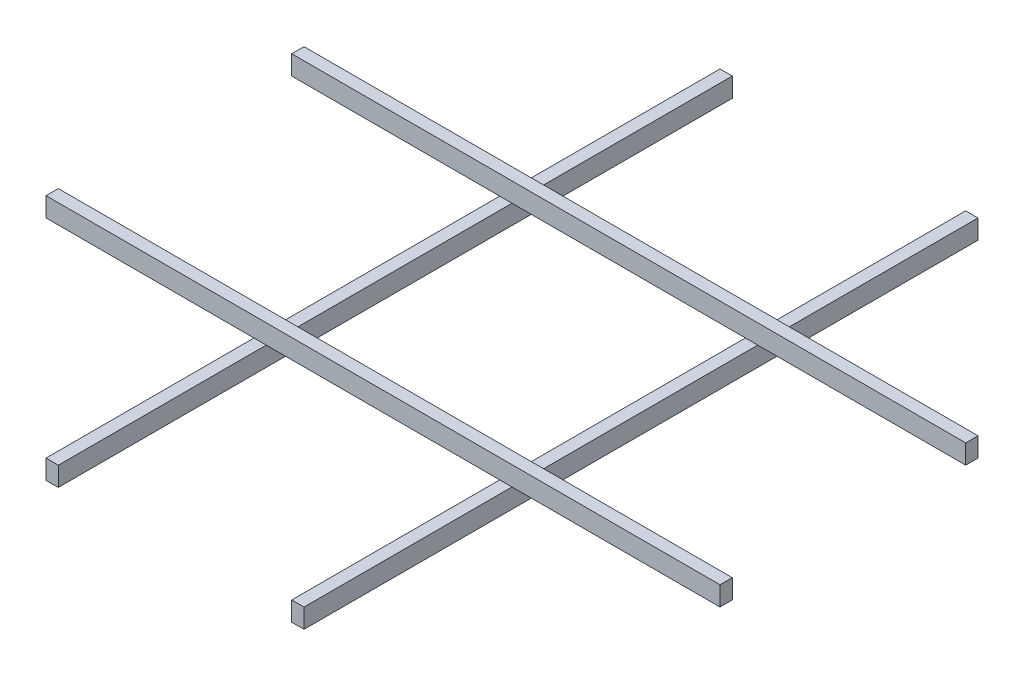
ISO-10303-21;
HEADER;
FILE_DESCRIPTION(('STEP AP214'),'2;1');
FILE_NAME('part.step','',(''),(''),'','','');
FILE_SCHEMA(('AUTOMOTIVE_DESIGN { 1 0 10303 214 1 1 1 1 }'));
ENDSEC;
DATA;
#1=APPLICATION_CONTEXT('core data for automotive mechanical design processes');
#2=APPLICATION_PROTOCOL_DEFINITION('international standard','automotive_design',2000,#1);
#3=PRODUCT_CONTEXT('',#1,'mechanical');
#4=PRODUCT('Part','Part','',(#3));
#5=PRODUCT_RELATED_PRODUCT_CATEGORY('part','',(#4));
#6=PRODUCT_DEFINITION_FORMATION('','',#4);
#7=PRODUCT_DEFINITION_CONTEXT('part definition',#1,'design');
#8=PRODUCT_DEFINITION('design','',#6,#7);
#9=PRODUCT_DEFINITION_SHAPE('','',#8);
#10=(LENGTH_UNIT() NAMED_UNIT(*) SI_UNIT(.MILLI.,.METRE.));
#11=(NAMED_UNIT(*) PLANE_ANGLE_UNIT() SI_UNIT($,.RADIAN.));
#12=(NAMED_UNIT(*) SI_UNIT($,.STERADIAN.) SOLID_ANGLE_UNIT());
#13=UNCERTAINTY_MEASURE_WITH_UNIT(LENGTH_MEASURE(1.E-05),#10,'distance_accuracy_value','');
#14=(GEOMETRIC_REPRESENTATION_CONTEXT(3) GLOBAL_UNCERTAINTY_ASSIGNED_CONTEXT((#13)) GLOBAL_UNIT_ASSIGNED_CONTEXT((#10,
#11,#12)) REPRESENTATION_CONTEXT('',''));
#15=CARTESIAN_POINT('',(0.,0.,0.));
#16=DIRECTION('',(0.,0.,1.));
#17=DIRECTION('',(1.,0.,0.));
#18=AXIS2_PLACEMENT_3D('',#15,#16,#17);
#19=CARTESIAN_POINT('',(4572.,209.55,-1593.85));
#20=DIRECTION('',(0.,0.,1.));
#21=DIRECTION('',(1.,0.,0.));
#22=AXIS2_PLACEMENT_3D('',#19,#20,#21);
#23=PLANE('',#22);
#24=DIRECTION('',(0.,1.,0.));
#25=VECTOR('',#24,1.);
#26=CARTESIAN_POINT('',(-304.8,209.55,-1593.85));
#27=LINE('',#26,#25);
#28=CARTESIAN_POINT('',(-304.8,69.85,-1593.85));
#29=VERTEX_POINT('',#28);
#30=CARTESIAN_POINT('',(-304.8,209.55,-1593.85));
#31=VERTEX_POINT('',#30);
#32=EDGE_CURVE('E126',#29,#31,#27,.T.);
#33=ORIENTED_EDGE('',*,*,#32,.T.);
#34=DIRECTION('',(-1.,0.,0.));
#35=VECTOR('',#34,1.);
#36=CARTESIAN_POINT('',(4572.,209.55,-1593.85));
#37=LINE('',#36,#35);
#38=CARTESIAN_POINT('',(4572.,209.55,-1593.85));
#39=VERTEX_POINT('',#38);
#40=EDGE_CURVE('E13',#39,#31,#37,.T.);
#41=ORIENTED_EDGE('',*,*,#40,.F.);
#42=DIRECTION('',(0.,1.,0.));
#43=VECTOR('',#42,1.);
#44=CARTESIAN_POINT('',(4572.,209.55,-1593.85));
#45=LINE('',#44,#43);
#46=CARTESIAN_POINT('',(4572.,69.85,-1593.85));
#47=VERTEX_POINT('',#46);
#48=EDGE_CURVE('E114',#47,#39,#45,.T.);
#49=ORIENTED_EDGE('',*,*,#48,.F.);
#50=DIRECTION('',(-1.,0.,0.));
#51=VECTOR('',#50,1.);
#52=CARTESIAN_POINT('',(4572.,69.85,-1593.85));
#53=LINE('',#52,#51);
#54=EDGE_CURVE('E122',#47,#29,#53,.T.);
#55=ORIENTED_EDGE('',*,*,#54,.T.);
#56=EDGE_LOOP('',(#33,#41,#49,#55));
#57=FACE_BOUND('',#56,.T.);
#58=ADVANCED_FACE('F63',(#57),#23,.F.);
#59=CARTESIAN_POINT('',(4572.,209.55,-1504.95));
#60=DIRECTION('',(0.,-1.,0.));
#61=DIRECTION('',(0.,0.,-1.));
#62=AXIS2_PLACEMENT_3D('',#59,#60,#61);
#63=PLANE('',#62);
#64=DIRECTION('',(0.,0.,1.));
#65=VECTOR('',#64,1.);
#66=CARTESIAN_POINT('',(-304.8,209.55,-1504.95));
#67=LINE('',#66,#65);
#68=CARTESIAN_POINT('',(-304.8,209.55,-1504.95));
#69=VERTEX_POINT('',#68);
#70=EDGE_CURVE('E118',#31,#69,#67,.T.);
#71=ORIENTED_EDGE('',*,*,#70,.T.);
#72=DIRECTION('',(-1.,0.,0.));
#73=VECTOR('',#72,1.);
#74=CARTESIAN_POINT('',(4572.,209.55,-1504.95));
#75=LINE('',#74,#73);
#76=CARTESIAN_POINT('',(4572.,209.55,-1504.95));
#77=VERTEX_POINT('',#76);
#78=EDGE_CURVE('E71',#77,#69,#75,.T.);
#79=ORIENTED_EDGE('',*,*,#78,.F.);
#80=DIRECTION('',(0.,0.,1.));
#81=VECTOR('',#80,1.);
#82=CARTESIAN_POINT('',(4572.,209.55,-1504.95));
#83=LINE('',#82,#81);
#84=EDGE_CURVE('E109',#39,#77,#83,.T.);
#85=ORIENTED_EDGE('',*,*,#84,.F.);
#86=ORIENTED_EDGE('',*,*,#40,.T.);
#87=EDGE_LOOP('',(#71,#79,#85,#86));
#88=FACE_BOUND('',#87,.T.);
#89=ADVANCED_FACE('F117',(#88),#63,.F.);
#90=CARTESIAN_POINT('',(4572.,209.55,-1504.95));
#91=DIRECTION('',(0.,0.,-1.));
#92=DIRECTION('',(-1.,0.,0.));
#93=AXIS2_PLACEMENT_3D('',#90,#91,#92);
#94=PLANE('',#93);
#95=DIRECTION('',(0.,-1.,0.));
#96=VECTOR('',#95,1.);
#97=CARTESIAN_POINT('',(-304.8,209.55,-1504.95));
#98=LINE('',#97,#96);
#99=CARTESIAN_POINT('',(-304.8,69.85,-1504.95));
#100=VERTEX_POINT('',#99);
#101=EDGE_CURVE('E96',#69,#100,#98,.T.);
#102=ORIENTED_EDGE('',*,*,#101,.T.);
#103=DIRECTION('',(-1.,0.,0.));
#104=VECTOR('',#103,1.);
#105=CARTESIAN_POINT('',(4572.,69.85,-1504.95));
#106=LINE('',#105,#104);
#107=CARTESIAN_POINT('',(4572.,69.85,-1504.95));
#108=VERTEX_POINT('',#107);
#109=EDGE_CURVE('E119',#108,#100,#106,.T.);
#110=ORIENTED_EDGE('',*,*,#109,.F.);
#111=DIRECTION('',(0.,-1.,0.));
#112=VECTOR('',#111,1.);
#113=CARTESIAN_POINT('',(4572.,209.55,-1504.95));
#114=LINE('',#113,#112);
#115=EDGE_CURVE('E112',#77,#108,#114,.T.);
#116=ORIENTED_EDGE('',*,*,#115,.F.);
#117=ORIENTED_EDGE('',*,*,#78,.T.);
#118=EDGE_LOOP('',(#102,#110,#116,#117));
#119=FACE_BOUND('',#118,.T.);
#120=ADVANCED_FACE('F120',(#119),#94,.F.);
#121=CARTESIAN_POINT('',(4572.,69.85,-1504.95));
#122=DIRECTION('',(0.,1.,0.));
#123=DIRECTION('',(0.,0.,1.));
#124=AXIS2_PLACEMENT_3D('',#121,#122,#123);
#125=PLANE('',#124);
#126=DIRECTION('',(0.,0.,-1.));
#127=VECTOR('',#126,1.);
#128=CARTESIAN_POINT('',(-304.8,69.85,-1504.95));
#129=LINE('',#128,#127);
#130=EDGE_CURVE('E102',#100,#29,#129,.T.);
#131=ORIENTED_EDGE('',*,*,#130,.T.);
#132=ORIENTED_EDGE('',*,*,#54,.F.);
#133=DIRECTION('',(0.,0.,-1.));
#134=VECTOR('',#133,1.);
#135=CARTESIAN_POINT('',(4572.,69.85,-1504.95));
#136=LINE('',#135,#134);
#137=EDGE_CURVE('E79',#108,#47,#136,.T.);
#138=ORIENTED_EDGE('',*,*,#137,.F.);
#139=ORIENTED_EDGE('',*,*,#109,.T.);
#140=EDGE_LOOP('',(#131,#132,#138,#139));
#141=FACE_BOUND('',#140,.T.);
#142=ADVANCED_FACE('F133',(#141),#125,.F.);
#143=CARTESIAN_POINT('',(4572.,139.7,-2794.));
#144=DIRECTION('',(1.,0.,0.));
#145=DIRECTION('',(0.,0.,-1.));
#146=AXIS2_PLACEMENT_3D('',#143,#144,#145);
#147=PLANE('',#146);
#148=ORIENTED_EDGE('',*,*,#48,.T.);
#149=ORIENTED_EDGE('',*,*,#84,.T.);
#150=ORIENTED_EDGE('',*,*,#115,.T.);
#151=ORIENTED_EDGE('',*,*,#137,.T.);
#152=EDGE_LOOP('',(#148,#149,#150,#151));
#153=FACE_BOUND('',#152,.T.);
#154=ADVANCED_FACE('F110',(#153),#147,.T.);
#155=CARTESIAN_POINT('',(-304.8,139.7,-2794.));
#156=DIRECTION('',(1.,0.,0.));
#157=DIRECTION('',(0.,0.,-1.));
#158=AXIS2_PLACEMENT_3D('',#155,#156,#157);
#159=PLANE('',#158);
#160=ORIENTED_EDGE('',*,*,#32,.F.);
#161=ORIENTED_EDGE('',*,*,#130,.F.);
#162=ORIENTED_EDGE('',*,*,#101,.F.);
#163=ORIENTED_EDGE('',*,*,#70,.F.);
#164=EDGE_LOOP('',(#160,#161,#162,#163));
#165=FACE_BOUND('',#164,.T.);
#166=ADVANCED_FACE('F136',(#165),#159,.F.);
#167=CLOSED_SHELL('',(#58,#89,#120,#142,#154,#166));
#168=MANIFOLD_SOLID_BREP('B2',#167);
#169=CARTESIAN_POINT('',(4572.,209.55,-3371.85));
#170=DIRECTION('',(0.,0.,1.));
#171=DIRECTION('',(1.,0.,0.));
#172=AXIS2_PLACEMENT_3D('',#169,#170,#171);
#173=PLANE('',#172);
#174=DIRECTION('',(0.,1.,0.));
#175=VECTOR('',#174,1.);
#176=CARTESIAN_POINT('',(-304.8,209.55,-3371.85));
#177=LINE('',#176,#175);
#178=CARTESIAN_POINT('',(-304.8,69.85,-3371.85));
#179=VERTEX_POINT('',#178);
#180=CARTESIAN_POINT('',(-304.8,209.55,-3371.85));
#181=VERTEX_POINT('',#180);
#182=EDGE_CURVE('E283',#179,#181,#177,.T.);
#183=ORIENTED_EDGE('',*,*,#182,.T.);
#184=DIRECTION('',(-1.,0.,0.));
#185=VECTOR('',#184,1.);
#186=CARTESIAN_POINT('',(4572.,209.55,-3371.85));
#187=LINE('',#186,#185);
#188=CARTESIAN_POINT('',(4572.,209.55,-3371.85));
#189=VERTEX_POINT('',#188);
#190=EDGE_CURVE('E61',#189,#181,#187,.T.);
#191=ORIENTED_EDGE('',*,*,#190,.F.);
#192=DIRECTION('',(0.,1.,0.));
#193=VECTOR('',#192,1.);
#194=CARTESIAN_POINT('',(4572.,209.55,-3371.85));
#195=LINE('',#194,#193);
#196=CARTESIAN_POINT('',(4572.,69.85,-3371.85));
#197=VERTEX_POINT('',#196);
#198=EDGE_CURVE('E271',#197,#189,#195,.T.);
#199=ORIENTED_EDGE('',*,*,#198,.F.);
#200=DIRECTION('',(-1.,0.,0.));
#201=VECTOR('',#200,1.);
#202=CARTESIAN_POINT('',(4572.,69.85,-3371.85));
#203=LINE('',#202,#201);
#204=EDGE_CURVE('E279',#197,#179,#203,.T.);
#205=ORIENTED_EDGE('',*,*,#204,.T.);
#206=EDGE_LOOP('',(#183,#191,#199,#205));
#207=FACE_BOUND('',#206,.T.);
#208=ADVANCED_FACE('F220',(#207),#173,.F.);
#209=CARTESIAN_POINT('',(4572.,209.55,-3282.95));
#210=DIRECTION('',(0.,-1.,0.));
#211=DIRECTION('',(0.,0.,-1.));
#212=AXIS2_PLACEMENT_3D('',#209,#210,#211);
#213=PLANE('',#212);
#214=DIRECTION('',(0.,0.,1.));
#215=VECTOR('',#214,1.);
#216=CARTESIAN_POINT('',(-304.8,209.55,-3282.95));
#217=LINE('',#216,#215);
#218=CARTESIAN_POINT('',(-304.8,209.55,-3282.95));
#219=VERTEX_POINT('',#218);
#220=EDGE_CURVE('E275',#181,#219,#217,.T.);
#221=ORIENTED_EDGE('',*,*,#220,.T.);
#222=DIRECTION('',(-1.,0.,0.));
#223=VECTOR('',#222,1.);
#224=CARTESIAN_POINT('',(4572.,209.55,-3282.95));
#225=LINE('',#224,#223);
#226=CARTESIAN_POINT('',(4572.,209.55,-3282.95));
#227=VERTEX_POINT('',#226);
#228=EDGE_CURVE('E228',#227,#219,#225,.T.);
#229=ORIENTED_EDGE('',*,*,#228,.F.);
#230=DIRECTION('',(0.,0.,1.));
#231=VECTOR('',#230,1.);
#232=CARTESIAN_POINT('',(4572.,209.55,-3282.95));
#233=LINE('',#232,#231);
#234=EDGE_CURVE('E266',#189,#227,#233,.T.);
#235=ORIENTED_EDGE('',*,*,#234,.F.);
#236=ORIENTED_EDGE('',*,*,#190,.T.);
#237=EDGE_LOOP('',(#221,#229,#235,#236));
#238=FACE_BOUND('',#237,.T.);
#239=ADVANCED_FACE('F274',(#238),#213,.F.);
#240=CARTESIAN_POINT('',(4572.,209.55,-3282.95));
#241=DIRECTION('',(0.,0.,-1.));
#242=DIRECTION('',(-1.,0.,0.));
#243=AXIS2_PLACEMENT_3D('',#240,#241,#242);
#244=PLANE('',#243);
#245=DIRECTION('',(0.,-1.,0.));
#246=VECTOR('',#245,1.);
#247=CARTESIAN_POINT('',(-304.8,209.55,-3282.95));
#248=LINE('',#247,#246);
#249=CARTESIAN_POINT('',(-304.8,69.85,-3282.95));
#250=VERTEX_POINT('',#249);
#251=EDGE_CURVE('E253',#219,#250,#248,.T.);
#252=ORIENTED_EDGE('',*,*,#251,.T.);
#253=DIRECTION('',(-1.,0.,0.));
#254=VECTOR('',#253,1.);
#255=CARTESIAN_POINT('',(4572.,69.85,-3282.95));
#256=LINE('',#255,#254);
#257=CARTESIAN_POINT('',(4572.,69.85,-3282.95));
#258=VERTEX_POINT('',#257);
#259=EDGE_CURVE('E276',#258,#250,#256,.T.);
#260=ORIENTED_EDGE('',*,*,#259,.F.);
#261=DIRECTION('',(0.,-1.,0.));
#262=VECTOR('',#261,1.);
#263=CARTESIAN_POINT('',(4572.,209.55,-3282.95));
#264=LINE('',#263,#262);
#265=EDGE_CURVE('E269',#227,#258,#264,.T.);
#266=ORIENTED_EDGE('',*,*,#265,.F.);
#267=ORIENTED_EDGE('',*,*,#228,.T.);
#268=EDGE_LOOP('',(#252,#260,#266,#267));
#269=FACE_BOUND('',#268,.T.);
#270=ADVANCED_FACE('F277',(#269),#244,.F.);
#271=CARTESIAN_POINT('',(4572.,69.85,-3282.95));
#272=DIRECTION('',(0.,1.,0.));
#273=DIRECTION('',(0.,0.,1.));
#274=AXIS2_PLACEMENT_3D('',#271,#272,#273);
#275=PLANE('',#274);
#276=DIRECTION('',(0.,0.,-1.));
#277=VECTOR('',#276,1.);
#278=CARTESIAN_POINT('',(-304.8,69.85,-3282.95));
#279=LINE('',#278,#277);
#280=EDGE_CURVE('E259',#250,#179,#279,.T.);
#281=ORIENTED_EDGE('',*,*,#280,.T.);
#282=ORIENTED_EDGE('',*,*,#204,.F.);
#283=DIRECTION('',(0.,0.,-1.));
#284=VECTOR('',#283,1.);
#285=CARTESIAN_POINT('',(4572.,69.85,-3282.95));
#286=LINE('',#285,#284);
#287=EDGE_CURVE('E236',#258,#197,#286,.T.);
#288=ORIENTED_EDGE('',*,*,#287,.F.);
#289=ORIENTED_EDGE('',*,*,#259,.T.);
#290=EDGE_LOOP('',(#281,#282,#288,#289));
#291=FACE_BOUND('',#290,.T.);
#292=ADVANCED_FACE('F290',(#291),#275,.F.);
#293=CARTESIAN_POINT('',(4572.,139.7,-4572.));
#294=DIRECTION('',(1.,0.,0.));
#295=DIRECTION('',(0.,0.,-1.));
#296=AXIS2_PLACEMENT_3D('',#293,#294,#295);
#297=PLANE('',#296);
#298=ORIENTED_EDGE('',*,*,#198,.T.);
#299=ORIENTED_EDGE('',*,*,#234,.T.);
#300=ORIENTED_EDGE('',*,*,#265,.T.);
#301=ORIENTED_EDGE('',*,*,#287,.T.);
#302=EDGE_LOOP('',(#298,#299,#300,#301));
#303=FACE_BOUND('',#302,.T.);
#304=ADVANCED_FACE('F267',(#303),#297,.T.);
#305=CARTESIAN_POINT('',(-304.8,139.7,-4572.));
#306=DIRECTION('',(1.,0.,0.));
#307=DIRECTION('',(0.,0.,-1.));
#308=AXIS2_PLACEMENT_3D('',#305,#306,#307);
#309=PLANE('',#308);
#310=ORIENTED_EDGE('',*,*,#182,.F.);
#311=ORIENTED_EDGE('',*,*,#280,.F.);
#312=ORIENTED_EDGE('',*,*,#251,.F.);
#313=ORIENTED_EDGE('',*,*,#220,.F.);
#314=EDGE_LOOP('',(#310,#311,#312,#313));
#315=FACE_BOUND('',#314,.T.);
#316=ADVANCED_FACE('F293',(#315),#309,.F.);
#317=CLOSED_SHELL('',(#208,#239,#270,#292,#304,#316));
#318=MANIFOLD_SOLID_BREP('B7',#317);
#319=CARTESIAN_POINT('',(2978.15,69.85,-4876.8));
#320=DIRECTION('',(1.,0.,0.));
#321=DIRECTION('',(0.,0.,-1.));
#322=AXIS2_PLACEMENT_3D('',#319,#320,#321);
#323=PLANE('',#322);
#324=DIRECTION('',(0.,1.,0.));
#325=VECTOR('',#324,1.);
#326=CARTESIAN_POINT('',(2978.15,69.85,2.28629310932819E-13));
#327=LINE('',#326,#325);
#328=CARTESIAN_POINT('',(2978.15,-69.85,2.28629310932819E-13));
#329=VERTEX_POINT('',#328);
#330=CARTESIAN_POINT('',(2978.15,69.85,2.28629310932819E-13));
#331=VERTEX_POINT('',#330);
#332=EDGE_CURVE('E439',#329,#331,#327,.T.);
#333=ORIENTED_EDGE('',*,*,#332,.T.);
#334=DIRECTION('',(0.,0.,1.));
#335=VECTOR('',#334,1.);
#336=CARTESIAN_POINT('',(2978.15,69.85,-4876.8));
#337=LINE('',#336,#335);
#338=CARTESIAN_POINT('',(2978.15,69.85,-4876.8));
#339=VERTEX_POINT('',#338);
#340=EDGE_CURVE('E218',#339,#331,#337,.T.);
#341=ORIENTED_EDGE('',*,*,#340,.F.);
#342=DIRECTION('',(0.,1.,0.));
#343=VECTOR('',#342,1.);
#344=CARTESIAN_POINT('',(2978.15,69.85,-4876.8));
#345=LINE('',#344,#343);
#346=CARTESIAN_POINT('',(2978.15,-69.85,-4876.8));
#347=VERTEX_POINT('',#346);
#348=EDGE_CURVE('E427',#347,#339,#345,.T.);
#349=ORIENTED_EDGE('',*,*,#348,.F.);
#350=DIRECTION('',(0.,0.,1.));
#351=VECTOR('',#350,1.);
#352=CARTESIAN_POINT('',(2978.15,-69.85,-4876.8));
#353=LINE('',#352,#351);
#354=EDGE_CURVE('E435',#347,#329,#353,.T.);
#355=ORIENTED_EDGE('',*,*,#354,.T.);
#356=EDGE_LOOP('',(#333,#341,#349,#355));
#357=FACE_BOUND('',#356,.T.);
#358=ADVANCED_FACE('F376',(#357),#323,.F.);
#359=CARTESIAN_POINT('',(3067.05,69.85,-4876.8));
#360=DIRECTION('',(0.,-1.,0.));
#361=DIRECTION('',(0.,0.,-1.));
#362=AXIS2_PLACEMENT_3D('',#359,#360,#361);
#363=PLANE('',#362);
#364=DIRECTION('',(1.,0.,0.));
#365=VECTOR('',#364,1.);
#366=CARTESIAN_POINT('',(3067.05,69.85,2.28629310932819E-13));
#367=LINE('',#366,#365);
#368=CARTESIAN_POINT('',(3067.05,69.85,2.28629310932819E-13));
#369=VERTEX_POINT('',#368);
#370=EDGE_CURVE('E431',#331,#369,#367,.T.);
#371=ORIENTED_EDGE('',*,*,#370,.T.);
#372=DIRECTION('',(0.,0.,1.));
#373=VECTOR('',#372,1.);
#374=CARTESIAN_POINT('',(3067.05,69.85,-4876.8));
#375=LINE('',#374,#373);
#376=CARTESIAN_POINT('',(3067.05,69.85,-4876.8));
#377=VERTEX_POINT('',#376);
#378=EDGE_CURVE('E384',#377,#369,#375,.T.);
#379=ORIENTED_EDGE('',*,*,#378,.F.);
#380=DIRECTION('',(1.,0.,0.));
#381=VECTOR('',#380,1.);
#382=CARTESIAN_POINT('',(3067.05,69.85,-4876.8));
#383=LINE('',#382,#381);
#384=EDGE_CURVE('E422',#339,#377,#383,.T.);
#385=ORIENTED_EDGE('',*,*,#384,.F.);
#386=ORIENTED_EDGE('',*,*,#340,.T.);
#387=EDGE_LOOP('',(#371,#379,#385,#386));
#388=FACE_BOUND('',#387,.T.);
#389=ADVANCED_FACE('F430',(#388),#363,.F.);
#390=CARTESIAN_POINT('',(3067.05,69.85,-4876.8));
#391=DIRECTION('',(-1.,0.,0.));
#392=DIRECTION('',(0.,0.,1.));
#393=AXIS2_PLACEMENT_3D('',#390,#391,#392);
#394=PLANE('',#393);
#395=DIRECTION('',(0.,-1.,0.));
#396=VECTOR('',#395,1.);
#397=CARTESIAN_POINT('',(3067.05,69.85,2.28629310932819E-13));
#398=LINE('',#397,#396);
#399=CARTESIAN_POINT('',(3067.05,-69.85,2.28629310932819E-13));
#400=VERTEX_POINT('',#399);
#401=EDGE_CURVE('E409',#369,#400,#398,.T.);
#402=ORIENTED_EDGE('',*,*,#401,.T.);
#403=DIRECTION('',(0.,0.,1.));
#404=VECTOR('',#403,1.);
#405=CARTESIAN_POINT('',(3067.05,-69.85,-4876.8));
#406=LINE('',#405,#404);
#407=CARTESIAN_POINT('',(3067.05,-69.85,-4876.8));
#408=VERTEX_POINT('',#407);
#409=EDGE_CURVE('E432',#408,#400,#406,.T.);
#410=ORIENTED_EDGE('',*,*,#409,.F.);
#411=DIRECTION('',(0.,-1.,0.));
#412=VECTOR('',#411,1.);
#413=CARTESIAN_POINT('',(3067.05,69.85,-4876.8));
#414=LINE('',#413,#412);
#415=EDGE_CURVE('E425',#377,#408,#414,.T.);
#416=ORIENTED_EDGE('',*,*,#415,.F.);
#417=ORIENTED_EDGE('',*,*,#378,.T.);
#418=EDGE_LOOP('',(#402,#410,#416,#417));
#419=FACE_BOUND('',#418,.T.);
#420=ADVANCED_FACE('F433',(#419),#394,.F.);
#421=CARTESIAN_POINT('',(3067.05,-69.85,-4876.8));
#422=DIRECTION('',(0.,1.,0.));
#423=DIRECTION('',(0.,0.,1.));
#424=AXIS2_PLACEMENT_3D('',#421,#422,#423);
#425=PLANE('',#424);
#426=DIRECTION('',(-1.,0.,0.));
#427=VECTOR('',#426,1.);
#428=CARTESIAN_POINT('',(3067.05,-69.85,2.28629310932819E-13));
#429=LINE('',#428,#427);
#430=EDGE_CURVE('E415',#400,#329,#429,.T.);
#431=ORIENTED_EDGE('',*,*,#430,.T.);
#432=ORIENTED_EDGE('',*,*,#354,.F.);
#433=DIRECTION('',(-1.,0.,0.));
#434=VECTOR('',#433,1.);
#435=CARTESIAN_POINT('',(3067.05,-69.85,-4876.8));
#436=LINE('',#435,#434);
#437=EDGE_CURVE('E392',#408,#347,#436,.T.);
#438=ORIENTED_EDGE('',*,*,#437,.F.);
#439=ORIENTED_EDGE('',*,*,#409,.T.);
#440=EDGE_LOOP('',(#431,#432,#438,#439));
#441=FACE_BOUND('',#440,.T.);
#442=ADVANCED_FACE('F446',(#441),#425,.F.);
#443=CARTESIAN_POINT('',(1778.,0.,-4876.8));
#444=DIRECTION('',(0.,0.,-1.));
#445=DIRECTION('',(-1.,0.,0.));
#446=AXIS2_PLACEMENT_3D('',#443,#444,#445);
#447=PLANE('',#446);
#448=ORIENTED_EDGE('',*,*,#348,.T.);
#449=ORIENTED_EDGE('',*,*,#384,.T.);
#450=ORIENTED_EDGE('',*,*,#415,.T.);
#451=ORIENTED_EDGE('',*,*,#437,.T.);
#452=EDGE_LOOP('',(#448,#449,#450,#451));
#453=FACE_BOUND('',#452,.T.);
#454=ADVANCED_FACE('F423',(#453),#447,.T.);
#455=CARTESIAN_POINT('',(1778.,0.,2.28629310932819E-13));
#456=DIRECTION('',(0.,0.,-1.));
#457=DIRECTION('',(-1.,0.,0.));
#458=AXIS2_PLACEMENT_3D('',#455,#456,#457);
#459=PLANE('',#458);
#460=ORIENTED_EDGE('',*,*,#332,.F.);
#461=ORIENTED_EDGE('',*,*,#430,.F.);
#462=ORIENTED_EDGE('',*,*,#401,.F.);
#463=ORIENTED_EDGE('',*,*,#370,.F.);
#464=EDGE_LOOP('',(#460,#461,#462,#463));
#465=FACE_BOUND('',#464,.T.);
#466=ADVANCED_FACE('F449',(#465),#459,.F.);
#467=CLOSED_SHELL('',(#358,#389,#420,#442,#454,#466));
#468=MANIFOLD_SOLID_BREP('B55',#467);
#469=CARTESIAN_POINT('',(1200.15,69.85,-4876.8));
#470=DIRECTION('',(1.,0.,0.));
#471=DIRECTION('',(0.,0.,-1.));
#472=AXIS2_PLACEMENT_3D('',#469,#470,#471);
#473=PLANE('',#472);
#474=DIRECTION('',(0.,1.,0.));
#475=VECTOR('',#474,1.);
#476=CARTESIAN_POINT('',(1200.15,69.85,8.88178419700125E-13));
#477=LINE('',#476,#475);
#478=CARTESIAN_POINT('',(1200.15,-69.85,8.88178419700125E-13));
#479=VERTEX_POINT('',#478);
#480=CARTESIAN_POINT('',(1200.15,69.85,8.88178419700125E-13));
#481=VERTEX_POINT('',#480);
#482=EDGE_CURVE('E586',#479,#481,#477,.T.);
#483=ORIENTED_EDGE('',*,*,#482,.T.);
#484=DIRECTION('',(0.,0.,1.));
#485=VECTOR('',#484,1.);
#486=CARTESIAN_POINT('',(1200.15,69.85,-4876.8));
#487=LINE('',#486,#485);
#488=CARTESIAN_POINT('',(1200.15,69.85,-4876.8));
#489=VERTEX_POINT('',#488);
#490=EDGE_CURVE('E374',#489,#481,#487,.T.);
#491=ORIENTED_EDGE('',*,*,#490,.F.);
#492=DIRECTION('',(0.,1.,0.));
#493=VECTOR('',#492,1.);
#494=CARTESIAN_POINT('',(1200.15,69.85,-4876.8));
#495=LINE('',#494,#493);
#496=CARTESIAN_POINT('',(1200.15,-69.85,-4876.8));
#497=VERTEX_POINT('',#496);
#498=EDGE_CURVE('E574',#497,#489,#495,.T.);
#499=ORIENTED_EDGE('',*,*,#498,.F.);
#500=DIRECTION('',(0.,0.,1.));
#501=VECTOR('',#500,1.);
#502=CARTESIAN_POINT('',(1200.15,-69.85,-4876.8));
#503=LINE('',#502,#501);
#504=EDGE_CURVE('E582',#497,#479,#503,.T.);
#505=ORIENTED_EDGE('',*,*,#504,.T.);
#506=EDGE_LOOP('',(#483,#491,#499,#505));
#507=FACE_BOUND('',#506,.T.);
#508=ADVANCED_FACE('F523',(#507),#473,.F.);
#509=CARTESIAN_POINT('',(1289.05,69.85,-4876.8));
#510=DIRECTION('',(0.,-1.,0.));
#511=DIRECTION('',(0.,0.,-1.));
#512=AXIS2_PLACEMENT_3D('',#509,#510,#511);
#513=PLANE('',#512);
#514=DIRECTION('',(1.,0.,0.));
#515=VECTOR('',#514,1.);
#516=CARTESIAN_POINT('',(1289.05,69.85,8.88178419700125E-13));
#517=LINE('',#516,#515);
#518=CARTESIAN_POINT('',(1289.05,69.85,8.88178419700125E-13));
#519=VERTEX_POINT('',#518);
#520=EDGE_CURVE('E578',#481,#519,#517,.T.);
#521=ORIENTED_EDGE('',*,*,#520,.T.);
#522=DIRECTION('',(0.,0.,1.));
#523=VECTOR('',#522,1.);
#524=CARTESIAN_POINT('',(1289.05,69.85,-4876.8));
#525=LINE('',#524,#523);
#526=CARTESIAN_POINT('',(1289.05,69.85,-4876.8));
#527=VERTEX_POINT('',#526);
#528=EDGE_CURVE('E531',#527,#519,#525,.T.);
#529=ORIENTED_EDGE('',*,*,#528,.F.);
#530=DIRECTION('',(1.,0.,0.));
#531=VECTOR('',#530,1.);
#532=CARTESIAN_POINT('',(1289.05,69.85,-4876.8));
#533=LINE('',#532,#531);
#534=EDGE_CURVE('E569',#489,#527,#533,.T.);
#535=ORIENTED_EDGE('',*,*,#534,.F.);
#536=ORIENTED_EDGE('',*,*,#490,.T.);
#537=EDGE_LOOP('',(#521,#529,#535,#536));
#538=FACE_BOUND('',#537,.T.);
#539=ADVANCED_FACE('F577',(#538),#513,.F.);
#540=CARTESIAN_POINT('',(1289.05,69.85,-4876.8));
#541=DIRECTION('',(-1.,0.,0.));
#542=DIRECTION('',(0.,0.,1.));
#543=AXIS2_PLACEMENT_3D('',#540,#541,#542);
#544=PLANE('',#543);
#545=DIRECTION('',(0.,-1.,0.));
#546=VECTOR('',#545,1.);
#547=CARTESIAN_POINT('',(1289.05,69.85,8.88178419700125E-13));
#548=LINE('',#547,#546);
#549=CARTESIAN_POINT('',(1289.05,-69.85,8.88178419700125E-13));
#550=VERTEX_POINT('',#549);
#551=EDGE_CURVE('E556',#519,#550,#548,.T.);
#552=ORIENTED_EDGE('',*,*,#551,.T.);
#553=DIRECTION('',(0.,0.,1.));
#554=VECTOR('',#553,1.);
#555=CARTESIAN_POINT('',(1289.05,-69.85,-4876.8));
#556=LINE('',#555,#554);
#557=CARTESIAN_POINT('',(1289.05,-69.85,-4876.8));
#558=VERTEX_POINT('',#557);
#559=EDGE_CURVE('E579',#558,#550,#556,.T.);
#560=ORIENTED_EDGE('',*,*,#559,.F.);
#561=DIRECTION('',(0.,-1.,0.));
#562=VECTOR('',#561,1.);
#563=CARTESIAN_POINT('',(1289.05,69.85,-4876.8));
#564=LINE('',#563,#562);
#565=EDGE_CURVE('E572',#527,#558,#564,.T.);
#566=ORIENTED_EDGE('',*,*,#565,.F.);
#567=ORIENTED_EDGE('',*,*,#528,.T.);
#568=EDGE_LOOP('',(#552,#560,#566,#567));
#569=FACE_BOUND('',#568,.T.);
#570=ADVANCED_FACE('F580',(#569),#544,.F.);
#571=CARTESIAN_POINT('',(1289.05,-69.85,-4876.8));
#572=DIRECTION('',(0.,1.,0.));
#573=DIRECTION('',(0.,0.,1.));
#574=AXIS2_PLACEMENT_3D('',#571,#572,#573);
#575=PLANE('',#574);
#576=DIRECTION('',(-1.,0.,0.));
#577=VECTOR('',#576,1.);
#578=CARTESIAN_POINT('',(1289.05,-69.85,8.88178419700125E-13));
#579=LINE('',#578,#577);
#580=EDGE_CURVE('E562',#550,#479,#579,.T.);
#581=ORIENTED_EDGE('',*,*,#580,.T.);
#582=ORIENTED_EDGE('',*,*,#504,.F.);
#583=DIRECTION('',(-1.,0.,0.));
#584=VECTOR('',#583,1.);
#585=CARTESIAN_POINT('',(1289.05,-69.85,-4876.8));
#586=LINE('',#585,#584);
#587=EDGE_CURVE('E539',#558,#497,#586,.T.);
#588=ORIENTED_EDGE('',*,*,#587,.F.);
#589=ORIENTED_EDGE('',*,*,#559,.T.);
#590=EDGE_LOOP('',(#581,#582,#588,#589));
#591=FACE_BOUND('',#590,.T.);
#592=ADVANCED_FACE('F593',(#591),#575,.F.);
#593=CARTESIAN_POINT('',(0.,0.,-4876.8));
#594=DIRECTION('',(0.,0.,-1.));
#595=DIRECTION('',(-1.,0.,0.));
#596=AXIS2_PLACEMENT_3D('',#593,#594,#595);
#597=PLANE('',#596);
#598=ORIENTED_EDGE('',*,*,#498,.T.);
#599=ORIENTED_EDGE('',*,*,#534,.T.);
#600=ORIENTED_EDGE('',*,*,#565,.T.);
#601=ORIENTED_EDGE('',*,*,#587,.T.);
#602=EDGE_LOOP('',(#598,#599,#600,#601));
#603=FACE_BOUND('',#602,.T.);
#604=ADVANCED_FACE('F570',(#603),#597,.T.);
#605=CARTESIAN_POINT('',(0.,0.,8.88178419700125E-13));
#606=DIRECTION('',(0.,0.,-1.));
#607=DIRECTION('',(-1.,0.,0.));
#608=AXIS2_PLACEMENT_3D('',#605,#606,#607);
#609=PLANE('',#608);
#610=ORIENTED_EDGE('',*,*,#482,.F.);
#611=ORIENTED_EDGE('',*,*,#580,.F.);
#612=ORIENTED_EDGE('',*,*,#551,.F.);
#613=ORIENTED_EDGE('',*,*,#520,.F.);
#614=EDGE_LOOP('',(#610,#611,#612,#613));
#615=FACE_BOUND('',#614,.T.);
#616=ADVANCED_FACE('F596',(#615),#609,.F.);
#617=CLOSED_SHELL('',(#508,#539,#570,#592,#604,#616));
#618=MANIFOLD_SOLID_BREP('B212',#617);
#619=ADVANCED_BREP_SHAPE_REPRESENTATION('',(#18,#168,#318,#468,#618),#14);
#620=SHAPE_DEFINITION_REPRESENTATION(#9,#619);
ENDSEC;
END-ISO-10303-21;
